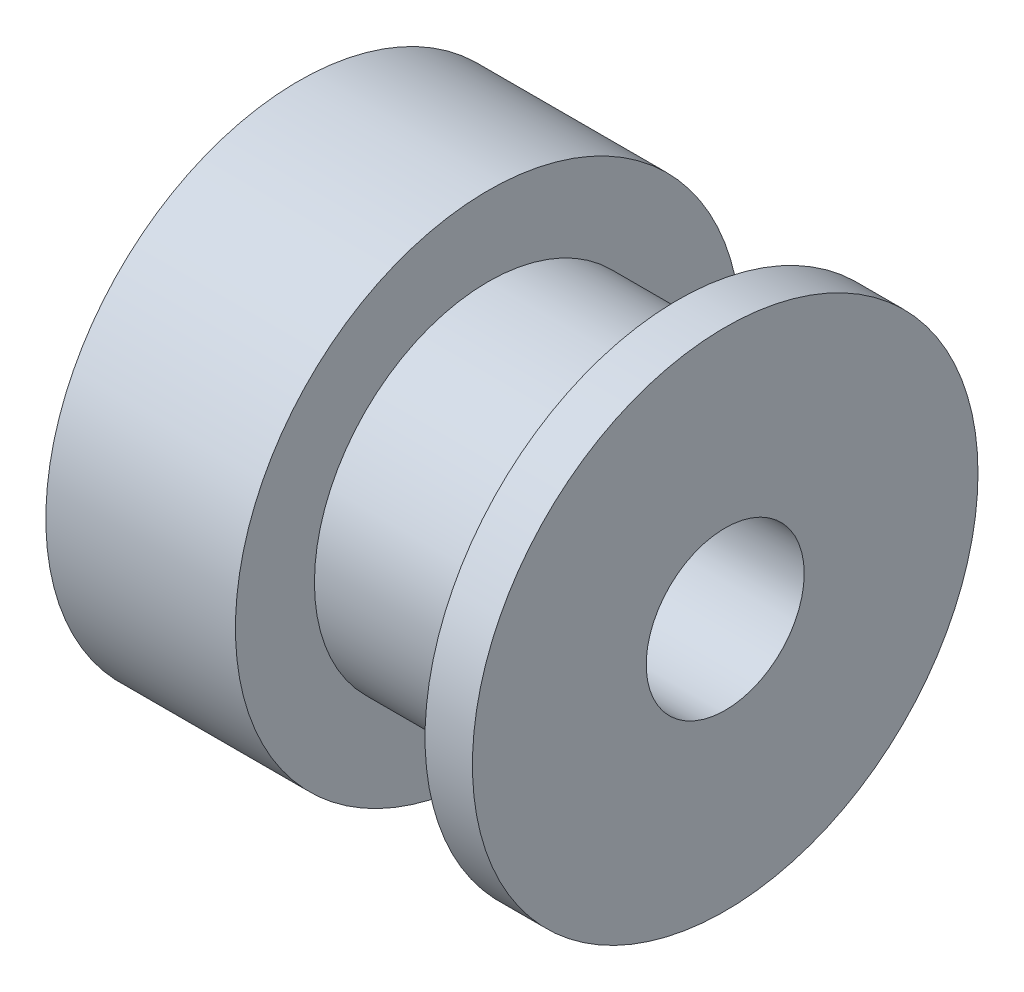
ISO-10303-21;
HEADER;
FILE_DESCRIPTION(('STEP AP214'),'2;1');
FILE_NAME('part.step','',(''),(''),'','','');
FILE_SCHEMA(('AUTOMOTIVE_DESIGN { 1 0 10303 214 1 1 1 1 }'));
ENDSEC;
DATA;
#1=APPLICATION_CONTEXT('core data for automotive mechanical design processes');
#2=APPLICATION_PROTOCOL_DEFINITION('international standard','automotive_design',2000,#1);
#3=PRODUCT_CONTEXT('',#1,'mechanical');
#4=PRODUCT('Part','Part','',(#3));
#5=PRODUCT_RELATED_PRODUCT_CATEGORY('part','',(#4));
#6=PRODUCT_DEFINITION_FORMATION('','',#4);
#7=PRODUCT_DEFINITION_CONTEXT('part definition',#1,'design');
#8=PRODUCT_DEFINITION('design','',#6,#7);
#9=PRODUCT_DEFINITION_SHAPE('','',#8);
#10=(LENGTH_UNIT() NAMED_UNIT(*) SI_UNIT(.MILLI.,.METRE.));
#11=(NAMED_UNIT(*) PLANE_ANGLE_UNIT() SI_UNIT($,.RADIAN.));
#12=(NAMED_UNIT(*) SI_UNIT($,.STERADIAN.) SOLID_ANGLE_UNIT());
#13=UNCERTAINTY_MEASURE_WITH_UNIT(LENGTH_MEASURE(1.E-05),#10,'distance_accuracy_value','');
#14=(GEOMETRIC_REPRESENTATION_CONTEXT(3) GLOBAL_UNCERTAINTY_ASSIGNED_CONTEXT((#13)) GLOBAL_UNIT_ASSIGNED_CONTEXT((#10,
#11,#12)) REPRESENTATION_CONTEXT('',''));
#15=CARTESIAN_POINT('',(0.,0.,0.));
#16=DIRECTION('',(0.,0.,1.));
#17=DIRECTION('',(1.,0.,0.));
#18=AXIS2_PLACEMENT_3D('',#15,#16,#17);
#19=CARTESIAN_POINT('',(6.,0.,0.));
#20=DIRECTION('',(1.,0.,0.));
#21=DIRECTION('',(0.,0.,-1.));
#22=AXIS2_PLACEMENT_3D('',#19,#20,#21);
#23=PLANE('',#22);
#24=CARTESIAN_POINT('',(6.,0.,0.));
#25=DIRECTION('',(1.,0.,0.));
#26=DIRECTION('',(0.,0.,-1.));
#27=AXIS2_PLACEMENT_3D('',#24,#25,#26);
#28=CIRCLE('',#27,8.);
#29=CARTESIAN_POINT('',(6.,0.,-8.));
#30=VERTEX_POINT('',#29);
#31=EDGE_CURVE('E10',#30,#30,#28,.T.);
#32=ORIENTED_EDGE('',*,*,#31,.T.);
#33=EDGE_LOOP('',(#32));
#34=FACE_BOUND('',#33,.T.);
#35=CARTESIAN_POINT('',(6.,0.,0.));
#36=DIRECTION('',(1.,0.,0.));
#37=DIRECTION('',(0.,0.,-1.));
#38=AXIS2_PLACEMENT_3D('',#35,#36,#37);
#39=CIRCLE('',#38,5.5);
#40=CARTESIAN_POINT('',(6.,0.,-5.5));
#41=VERTEX_POINT('',#40);
#42=EDGE_CURVE('E47',#41,#41,#39,.T.);
#43=ORIENTED_EDGE('',*,*,#42,.F.);
#44=EDGE_LOOP('',(#43));
#45=FACE_BOUND('',#44,.T.);
#46=ADVANCED_FACE('F31',(#34,#45),#23,.T.);
#47=CARTESIAN_POINT('',(0.,0.,0.));
#48=DIRECTION('',(1.,0.,0.));
#49=DIRECTION('',(0.,0.,-1.));
#50=AXIS2_PLACEMENT_3D('',#47,#48,#49);
#51=PLANE('',#50);
#52=CARTESIAN_POINT('',(0.,0.,0.));
#53=DIRECTION('',(1.,0.,0.));
#54=DIRECTION('',(0.,0.,-1.));
#55=AXIS2_PLACEMENT_3D('',#52,#53,#54);
#56=CIRCLE('',#55,8.);
#57=CARTESIAN_POINT('',(0.,0.,-8.));
#58=VERTEX_POINT('',#57);
#59=EDGE_CURVE('E35',#58,#58,#56,.T.);
#60=ORIENTED_EDGE('',*,*,#59,.F.);
#61=EDGE_LOOP('',(#60));
#62=FACE_BOUND('',#61,.T.);
#63=CARTESIAN_POINT('',(0.,0.,0.));
#64=DIRECTION('',(1.,0.,0.));
#65=DIRECTION('',(0.,0.,-1.));
#66=AXIS2_PLACEMENT_3D('',#63,#64,#65);
#67=CIRCLE('',#66,2.5);
#68=CARTESIAN_POINT('',(0.,0.,-2.5));
#69=VERTEX_POINT('',#68);
#70=EDGE_CURVE('E42',#69,#69,#67,.T.);
#71=ORIENTED_EDGE('',*,*,#70,.T.);
#72=EDGE_LOOP('',(#71));
#73=FACE_BOUND('',#72,.T.);
#74=ADVANCED_FACE('F80',(#62,#73),#51,.F.);
#75=CARTESIAN_POINT('',(6.,0.,0.));
#76=DIRECTION('',(-1.,0.,0.));
#77=DIRECTION('',(0.,0.,1.));
#78=AXIS2_PLACEMENT_3D('',#75,#76,#77);
#79=CYLINDRICAL_SURFACE('',#78,8.);
#80=ORIENTED_EDGE('',*,*,#31,.F.);
#81=EDGE_LOOP('',(#80));
#82=FACE_BOUND('',#81,.T.);
#83=ORIENTED_EDGE('',*,*,#59,.T.);
#84=EDGE_LOOP('',(#83));
#85=FACE_BOUND('',#84,.T.);
#86=ADVANCED_FACE('F33',(#82,#85),#79,.T.);
#87=CARTESIAN_POINT('',(6.,0.,0.));
#88=DIRECTION('',(-1.,0.,0.));
#89=DIRECTION('',(0.,0.,1.));
#90=AXIS2_PLACEMENT_3D('',#87,#88,#89);
#91=CYLINDRICAL_SURFACE('',#90,2.5);
#92=ORIENTED_EDGE('',*,*,#70,.F.);
#93=EDGE_LOOP('',(#92));
#94=FACE_BOUND('',#93,.T.);
#95=CARTESIAN_POINT('',(13.5,0.,0.));
#96=DIRECTION('',(1.,0.,0.));
#97=DIRECTION('',(0.,0.,-1.));
#98=AXIS2_PLACEMENT_3D('',#95,#96,#97);
#99=CIRCLE('',#98,2.5);
#100=CARTESIAN_POINT('',(13.5,0.,-2.5));
#101=VERTEX_POINT('',#100);
#102=EDGE_CURVE('E56',#101,#101,#99,.T.);
#103=ORIENTED_EDGE('',*,*,#102,.T.);
#104=EDGE_LOOP('',(#103));
#105=FACE_BOUND('',#104,.T.);
#106=ADVANCED_FACE('F62',(#94,#105),#91,.F.);
#107=CARTESIAN_POINT('',(12.,0.,0.));
#108=DIRECTION('',(-1.,0.,0.));
#109=DIRECTION('',(0.,0.,1.));
#110=AXIS2_PLACEMENT_3D('',#107,#108,#109);
#111=CYLINDRICAL_SURFACE('',#110,5.5);
#112=CARTESIAN_POINT('',(12.,0.,0.));
#113=DIRECTION('',(1.,0.,0.));
#114=DIRECTION('',(0.,0.,-1.));
#115=AXIS2_PLACEMENT_3D('',#112,#113,#114);
#116=CIRCLE('',#115,5.5);
#117=CARTESIAN_POINT('',(12.,0.,-5.5));
#118=VERTEX_POINT('',#117);
#119=EDGE_CURVE('E46',#118,#118,#116,.T.);
#120=ORIENTED_EDGE('',*,*,#119,.F.);
#121=EDGE_LOOP('',(#120));
#122=FACE_BOUND('',#121,.T.);
#123=ORIENTED_EDGE('',*,*,#42,.T.);
#124=EDGE_LOOP('',(#123));
#125=FACE_BOUND('',#124,.T.);
#126=ADVANCED_FACE('F67',(#122,#125),#111,.T.);
#127=CARTESIAN_POINT('',(13.5,0.,0.));
#128=DIRECTION('',(1.,0.,0.));
#129=DIRECTION('',(0.,0.,-1.));
#130=AXIS2_PLACEMENT_3D('',#127,#128,#129);
#131=PLANE('',#130);
#132=CARTESIAN_POINT('',(13.5,0.,0.));
#133=DIRECTION('',(1.,0.,0.));
#134=DIRECTION('',(0.,0.,-1.));
#135=AXIS2_PLACEMENT_3D('',#132,#133,#134);
#136=CIRCLE('',#135,8.);
#137=CARTESIAN_POINT('',(13.5,0.,-8.));
#138=VERTEX_POINT('',#137);
#139=EDGE_CURVE('E50',#138,#138,#136,.T.);
#140=ORIENTED_EDGE('',*,*,#139,.T.);
#141=EDGE_LOOP('',(#140));
#142=FACE_BOUND('',#141,.T.);
#143=ORIENTED_EDGE('',*,*,#102,.F.);
#144=EDGE_LOOP('',(#143));
#145=FACE_BOUND('',#144,.T.);
#146=ADVANCED_FACE('F64',(#142,#145),#131,.T.);
#147=CARTESIAN_POINT('',(12.,0.,0.));
#148=DIRECTION('',(1.,0.,0.));
#149=DIRECTION('',(0.,0.,-1.));
#150=AXIS2_PLACEMENT_3D('',#147,#148,#149);
#151=PLANE('',#150);
#152=ORIENTED_EDGE('',*,*,#119,.T.);
#153=EDGE_LOOP('',(#152));
#154=FACE_BOUND('',#153,.T.);
#155=CARTESIAN_POINT('',(12.,0.,0.));
#156=DIRECTION('',(1.,0.,0.));
#157=DIRECTION('',(0.,0.,-1.));
#158=AXIS2_PLACEMENT_3D('',#155,#156,#157);
#159=CIRCLE('',#158,8.);
#160=CARTESIAN_POINT('',(12.,0.,-8.));
#161=VERTEX_POINT('',#160);
#162=EDGE_CURVE('E53',#161,#161,#159,.T.);
#163=ORIENTED_EDGE('',*,*,#162,.F.);
#164=EDGE_LOOP('',(#163));
#165=FACE_BOUND('',#164,.T.);
#166=ADVANCED_FACE('F66',(#154,#165),#151,.F.);
#167=CARTESIAN_POINT('',(13.5,0.,0.));
#168=DIRECTION('',(-1.,0.,0.));
#169=DIRECTION('',(0.,0.,1.));
#170=AXIS2_PLACEMENT_3D('',#167,#168,#169);
#171=CYLINDRICAL_SURFACE('',#170,8.);
#172=ORIENTED_EDGE('',*,*,#139,.F.);
#173=EDGE_LOOP('',(#172));
#174=FACE_BOUND('',#173,.T.);
#175=ORIENTED_EDGE('',*,*,#162,.T.);
#176=EDGE_LOOP('',(#175));
#177=FACE_BOUND('',#176,.T.);
#178=ADVANCED_FACE('F74',(#174,#177),#171,.T.);
#179=CLOSED_SHELL('',(#46,#74,#86,#106,#126,#146,#166,#178));
#180=MANIFOLD_SOLID_BREP('B2',#179);
#181=ADVANCED_BREP_SHAPE_REPRESENTATION('',(#18,#180),#14);
#182=SHAPE_DEFINITION_REPRESENTATION(#9,#181);
ENDSEC;
END-ISO-10303-21;
